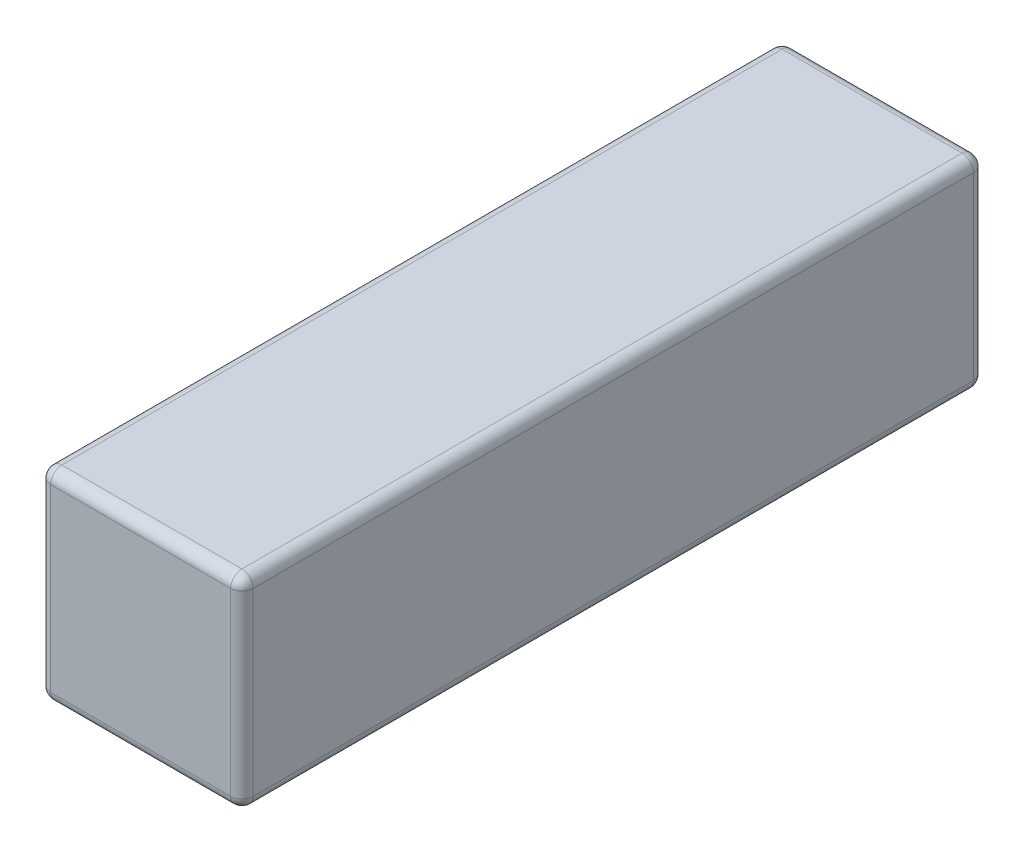
ISO-10303-21;
HEADER;
FILE_DESCRIPTION(('STEP AP214'),'2;1');
FILE_NAME('part.step','',(''),(''),'','','');
FILE_SCHEMA(('AUTOMOTIVE_DESIGN { 1 0 10303 214 1 1 1 1 }'));
ENDSEC;
DATA;
#1=APPLICATION_CONTEXT('core data for automotive mechanical design processes');
#2=APPLICATION_PROTOCOL_DEFINITION('international standard','automotive_design',2000,#1);
#3=PRODUCT_CONTEXT('',#1,'mechanical');
#4=PRODUCT('Part','Part','',(#3));
#5=PRODUCT_RELATED_PRODUCT_CATEGORY('part','',(#4));
#6=PRODUCT_DEFINITION_FORMATION('','',#4);
#7=PRODUCT_DEFINITION_CONTEXT('part definition',#1,'design');
#8=PRODUCT_DEFINITION('design','',#6,#7);
#9=PRODUCT_DEFINITION_SHAPE('','',#8);
#10=(LENGTH_UNIT() NAMED_UNIT(*) SI_UNIT(.MILLI.,.METRE.));
#11=(NAMED_UNIT(*) PLANE_ANGLE_UNIT() SI_UNIT($,.RADIAN.));
#12=(NAMED_UNIT(*) SI_UNIT($,.STERADIAN.) SOLID_ANGLE_UNIT());
#13=UNCERTAINTY_MEASURE_WITH_UNIT(LENGTH_MEASURE(1.E-05),#10,'distance_accuracy_value','');
#14=(GEOMETRIC_REPRESENTATION_CONTEXT(3) GLOBAL_UNCERTAINTY_ASSIGNED_CONTEXT((#13)) GLOBAL_UNIT_ASSIGNED_CONTEXT((#10,
#11,#12)) REPRESENTATION_CONTEXT('',''));
#15=CARTESIAN_POINT('',(0.,0.,0.));
#16=DIRECTION('',(0.,0.,1.));
#17=DIRECTION('',(1.,0.,0.));
#18=AXIS2_PLACEMENT_3D('',#15,#16,#17);
#19=CARTESIAN_POINT('',(-4.5,4.5,33.));
#20=DIRECTION('',(1.,0.,0.));
#21=DIRECTION('',(0.,1.,0.));
#22=AXIS2_PLACEMENT_3D('',#19,#20,#21);
#23=PLANE('',#22);
#24=DIRECTION('',(0.,-1.,0.));
#25=VECTOR('',#24,1.);
#26=CARTESIAN_POINT('',(-4.5,4.5,32.5));
#27=LINE('',#26,#25);
#28=CARTESIAN_POINT('',(-4.5,-4.,32.5));
#29=VERTEX_POINT('',#28);
#30=CARTESIAN_POINT('',(-4.5,4.,32.5));
#31=VERTEX_POINT('',#30);
#32=EDGE_CURVE('E196',#29,#31,#27,.F.);
#33=ORIENTED_EDGE('',*,*,#32,.T.);
#34=DIRECTION('',(0.,0.,-1.));
#35=VECTOR('',#34,1.);
#36=CARTESIAN_POINT('',(-4.5,4.,33.));
#37=LINE('',#36,#35);
#38=CARTESIAN_POINT('',(-4.5,4.,0.5));
#39=VERTEX_POINT('',#38);
#40=EDGE_CURVE('E201',#31,#39,#37,.T.);
#41=ORIENTED_EDGE('',*,*,#40,.T.);
#42=DIRECTION('',(0.,-1.,0.));
#43=VECTOR('',#42,1.);
#44=CARTESIAN_POINT('',(-4.5,-4.5,0.5));
#45=LINE('',#44,#43);
#46=CARTESIAN_POINT('',(-4.5,-4.,0.5));
#47=VERTEX_POINT('',#46);
#48=EDGE_CURVE('E198',#39,#47,#45,.T.);
#49=ORIENTED_EDGE('',*,*,#48,.T.);
#50=DIRECTION('',(0.,0.,-1.));
#51=VECTOR('',#50,1.);
#52=CARTESIAN_POINT('',(-4.5,-4.,33.));
#53=LINE('',#52,#51);
#54=EDGE_CURVE('E194',#47,#29,#53,.F.);
#55=ORIENTED_EDGE('',*,*,#54,.T.);
#56=EDGE_LOOP('',(#33,#41,#49,#55));
#57=FACE_BOUND('',#56,.T.);
#58=ADVANCED_FACE('F33',(#57),#23,.F.);
#59=CARTESIAN_POINT('',(4.5,-4.5,33.));
#60=DIRECTION('',(0.,1.,0.));
#61=DIRECTION('',(-1.,0.,0.));
#62=AXIS2_PLACEMENT_3D('',#59,#60,#61);
#63=PLANE('',#62);
#64=DIRECTION('',(1.,0.,0.));
#65=VECTOR('',#64,1.);
#66=CARTESIAN_POINT('',(4.5,-4.5,32.5));
#67=LINE('',#66,#65);
#68=CARTESIAN_POINT('',(4.,-4.5,32.5));
#69=VERTEX_POINT('',#68);
#70=CARTESIAN_POINT('',(-4.,-4.5,32.5));
#71=VERTEX_POINT('',#70);
#72=EDGE_CURVE('E187',#69,#71,#67,.F.);
#73=ORIENTED_EDGE('',*,*,#72,.T.);
#74=DIRECTION('',(0.,0.,-1.));
#75=VECTOR('',#74,1.);
#76=CARTESIAN_POINT('',(-4.,-4.5,33.));
#77=LINE('',#76,#75);
#78=CARTESIAN_POINT('',(-4.,-4.5,0.5));
#79=VERTEX_POINT('',#78);
#80=EDGE_CURVE('E192',#71,#79,#77,.T.);
#81=ORIENTED_EDGE('',*,*,#80,.T.);
#82=DIRECTION('',(1.,0.,0.));
#83=VECTOR('',#82,1.);
#84=CARTESIAN_POINT('',(4.5,-4.5,0.5));
#85=LINE('',#84,#83);
#86=CARTESIAN_POINT('',(4.,-4.5,0.5));
#87=VERTEX_POINT('',#86);
#88=EDGE_CURVE('E189',#79,#87,#85,.T.);
#89=ORIENTED_EDGE('',*,*,#88,.T.);
#90=DIRECTION('',(0.,0.,-1.));
#91=VECTOR('',#90,1.);
#92=CARTESIAN_POINT('',(4.,-4.5,33.));
#93=LINE('',#92,#91);
#94=EDGE_CURVE('E185',#87,#69,#93,.F.);
#95=ORIENTED_EDGE('',*,*,#94,.T.);
#96=EDGE_LOOP('',(#73,#81,#89,#95));
#97=FACE_BOUND('',#96,.T.);
#98=ADVANCED_FACE('F287',(#97),#63,.F.);
#99=CARTESIAN_POINT('',(4.5,4.5,33.));
#100=DIRECTION('',(-1.,0.,0.));
#101=DIRECTION('',(0.,-1.,0.));
#102=AXIS2_PLACEMENT_3D('',#99,#100,#101);
#103=PLANE('',#102);
#104=DIRECTION('',(0.,1.,0.));
#105=VECTOR('',#104,1.);
#106=CARTESIAN_POINT('',(4.5,4.5,32.5));
#107=LINE('',#106,#105);
#108=CARTESIAN_POINT('',(4.5,4.,32.5));
#109=VERTEX_POINT('',#108);
#110=CARTESIAN_POINT('',(4.5,-4.,32.5));
#111=VERTEX_POINT('',#110);
#112=EDGE_CURVE('E178',#109,#111,#107,.F.);
#113=ORIENTED_EDGE('',*,*,#112,.T.);
#114=DIRECTION('',(0.,0.,-1.));
#115=VECTOR('',#114,1.);
#116=CARTESIAN_POINT('',(4.5,-4.,33.));
#117=LINE('',#116,#115);
#118=CARTESIAN_POINT('',(4.5,-4.,0.5));
#119=VERTEX_POINT('',#118);
#120=EDGE_CURVE('E183',#111,#119,#117,.T.);
#121=ORIENTED_EDGE('',*,*,#120,.T.);
#122=DIRECTION('',(0.,1.,0.));
#123=VECTOR('',#122,1.);
#124=CARTESIAN_POINT('',(4.5,4.5,0.5));
#125=LINE('',#124,#123);
#126=CARTESIAN_POINT('',(4.5,4.,0.5));
#127=VERTEX_POINT('',#126);
#128=EDGE_CURVE('E180',#119,#127,#125,.T.);
#129=ORIENTED_EDGE('',*,*,#128,.T.);
#130=DIRECTION('',(0.,0.,-1.));
#131=VECTOR('',#130,1.);
#132=CARTESIAN_POINT('',(4.5,4.,33.));
#133=LINE('',#132,#131);
#134=EDGE_CURVE('E176',#127,#109,#133,.F.);
#135=ORIENTED_EDGE('',*,*,#134,.T.);
#136=EDGE_LOOP('',(#113,#121,#129,#135));
#137=FACE_BOUND('',#136,.T.);
#138=ADVANCED_FACE('F307',(#137),#103,.F.);
#139=CARTESIAN_POINT('',(4.5,4.5,33.));
#140=DIRECTION('',(0.,-1.,0.));
#141=DIRECTION('',(1.,0.,0.));
#142=AXIS2_PLACEMENT_3D('',#139,#140,#141);
#143=PLANE('',#142);
#144=DIRECTION('',(-1.,0.,0.));
#145=VECTOR('',#144,1.);
#146=CARTESIAN_POINT('',(-4.5,4.5,0.5));
#147=LINE('',#146,#145);
#148=CARTESIAN_POINT('',(4.,4.5,0.5));
#149=VERTEX_POINT('',#148);
#150=CARTESIAN_POINT('',(-4.,4.5,0.5));
#151=VERTEX_POINT('',#150);
#152=EDGE_CURVE('E136',#149,#151,#147,.T.);
#153=ORIENTED_EDGE('',*,*,#152,.T.);
#154=DIRECTION('',(0.,0.,-1.));
#155=VECTOR('',#154,1.);
#156=CARTESIAN_POINT('',(-4.,4.5,33.));
#157=LINE('',#156,#155);
#158=CARTESIAN_POINT('',(-4.,4.5,32.5));
#159=VERTEX_POINT('',#158);
#160=EDGE_CURVE('E132',#151,#159,#157,.F.);
#161=ORIENTED_EDGE('',*,*,#160,.T.);
#162=DIRECTION('',(-1.,0.,0.));
#163=VECTOR('',#162,1.);
#164=CARTESIAN_POINT('',(4.5,4.5,32.5));
#165=LINE('',#164,#163);
#166=CARTESIAN_POINT('',(4.,4.5,32.5));
#167=VERTEX_POINT('',#166);
#168=EDGE_CURVE('E124',#159,#167,#165,.F.);
#169=ORIENTED_EDGE('',*,*,#168,.T.);
#170=DIRECTION('',(0.,0.,-1.));
#171=VECTOR('',#170,1.);
#172=CARTESIAN_POINT('',(4.,4.5,33.));
#173=LINE('',#172,#171);
#174=EDGE_CURVE('E129',#167,#149,#173,.T.);
#175=ORIENTED_EDGE('',*,*,#174,.T.);
#176=EDGE_LOOP('',(#153,#161,#169,#175));
#177=FACE_BOUND('',#176,.T.);
#178=ADVANCED_FACE('F127',(#177),#143,.F.);
#179=CARTESIAN_POINT('',(0.,0.,33.));
#180=DIRECTION('',(0.,0.,-1.));
#181=DIRECTION('',(-1.,0.,0.));
#182=AXIS2_PLACEMENT_3D('',#179,#180,#181);
#183=PLANE('',#182);
#184=DIRECTION('',(-1.,0.,0.));
#185=VECTOR('',#184,1.);
#186=CARTESIAN_POINT('',(0.,4.,33.));
#187=LINE('',#186,#185);
#188=CARTESIAN_POINT('',(4.,4.,33.));
#189=VERTEX_POINT('',#188);
#190=CARTESIAN_POINT('',(-4.,4.,33.));
#191=VERTEX_POINT('',#190);
#192=EDGE_CURVE('E143',#189,#191,#187,.T.);
#193=ORIENTED_EDGE('',*,*,#192,.T.);
#194=DIRECTION('',(0.,-1.,0.));
#195=VECTOR('',#194,1.);
#196=CARTESIAN_POINT('',(-4.,0.,33.));
#197=LINE('',#196,#195);
#198=CARTESIAN_POINT('',(-4.,-4.,33.));
#199=VERTEX_POINT('',#198);
#200=EDGE_CURVE('E11',#191,#199,#197,.T.);
#201=ORIENTED_EDGE('',*,*,#200,.T.);
#202=DIRECTION('',(1.,0.,0.));
#203=VECTOR('',#202,1.);
#204=CARTESIAN_POINT('',(0.,-4.,33.));
#205=LINE('',#204,#203);
#206=CARTESIAN_POINT('',(4.,-4.,33.));
#207=VERTEX_POINT('',#206);
#208=EDGE_CURVE('E42',#199,#207,#205,.T.);
#209=ORIENTED_EDGE('',*,*,#208,.T.);
#210=DIRECTION('',(0.,1.,0.));
#211=VECTOR('',#210,1.);
#212=CARTESIAN_POINT('',(4.,0.,33.));
#213=LINE('',#212,#211);
#214=EDGE_CURVE('E204',#207,#189,#213,.T.);
#215=ORIENTED_EDGE('',*,*,#214,.T.);
#216=EDGE_LOOP('',(#193,#201,#209,#215));
#217=FACE_BOUND('',#216,.T.);
#218=ADVANCED_FACE('F260',(#217),#183,.F.);
#219=CARTESIAN_POINT('',(0.,0.,0.));
#220=DIRECTION('',(0.,0.,-1.));
#221=DIRECTION('',(-1.,0.,0.));
#222=AXIS2_PLACEMENT_3D('',#219,#220,#221);
#223=PLANE('',#222);
#224=DIRECTION('',(0.,-1.,0.));
#225=VECTOR('',#224,1.);
#226=CARTESIAN_POINT('',(-4.,4.5,0.));
#227=LINE('',#226,#225);
#228=CARTESIAN_POINT('',(-4.,-4.,0.));
#229=VERTEX_POINT('',#228);
#230=CARTESIAN_POINT('',(-4.,4.,0.));
#231=VERTEX_POINT('',#230);
#232=EDGE_CURVE('E167',#229,#231,#227,.F.);
#233=ORIENTED_EDGE('',*,*,#232,.T.);
#234=DIRECTION('',(-1.,0.,0.));
#235=VECTOR('',#234,1.);
#236=CARTESIAN_POINT('',(4.5,4.,0.));
#237=LINE('',#236,#235);
#238=CARTESIAN_POINT('',(4.,4.,0.));
#239=VERTEX_POINT('',#238);
#240=EDGE_CURVE('E173',#231,#239,#237,.F.);
#241=ORIENTED_EDGE('',*,*,#240,.T.);
#242=DIRECTION('',(0.,1.,0.));
#243=VECTOR('',#242,1.);
#244=CARTESIAN_POINT('',(4.,-4.5,0.));
#245=LINE('',#244,#243);
#246=CARTESIAN_POINT('',(4.,-4.,0.));
#247=VERTEX_POINT('',#246);
#248=EDGE_CURVE('E171',#239,#247,#245,.F.);
#249=ORIENTED_EDGE('',*,*,#248,.T.);
#250=DIRECTION('',(1.,0.,0.));
#251=VECTOR('',#250,1.);
#252=CARTESIAN_POINT('',(-4.5,-4.,0.));
#253=LINE('',#252,#251);
#254=EDGE_CURVE('E169',#247,#229,#253,.F.);
#255=ORIENTED_EDGE('',*,*,#254,.T.);
#256=EDGE_LOOP('',(#233,#241,#249,#255));
#257=FACE_BOUND('',#256,.T.);
#258=ADVANCED_FACE('F340',(#257),#223,.T.);
#259=CARTESIAN_POINT('',(0.,-4.,32.5));
#260=DIRECTION('',(1.,0.,0.));
#261=DIRECTION('',(0.,1.,0.));
#262=AXIS2_PLACEMENT_3D('',#259,#260,#261);
#263=CYLINDRICAL_SURFACE('',#262,0.5);
#264=CARTESIAN_POINT('',(4.,-4.,32.5));
#265=DIRECTION('',(1.,0.,0.));
#266=DIRECTION('',(0.,0.,-1.));
#267=AXIS2_PLACEMENT_3D('',#264,#265,#266);
#268=CIRCLE('',#267,0.5);
#269=EDGE_CURVE('E37',#207,#69,#268,.T.);
#270=ORIENTED_EDGE('',*,*,#269,.F.);
#271=ORIENTED_EDGE('',*,*,#208,.F.);
#272=CARTESIAN_POINT('',(-4.,-4.,32.5));
#273=DIRECTION('',(-1.,0.,0.));
#274=DIRECTION('',(0.,0.,1.));
#275=AXIS2_PLACEMENT_3D('',#272,#273,#274);
#276=CIRCLE('',#275,0.5);
#277=EDGE_CURVE('E163',#71,#199,#276,.T.);
#278=ORIENTED_EDGE('',*,*,#277,.F.);
#279=ORIENTED_EDGE('',*,*,#72,.F.);
#280=EDGE_LOOP('',(#270,#271,#278,#279));
#281=FACE_BOUND('',#280,.T.);
#282=ADVANCED_FACE('F35',(#281),#263,.T.);
#283=CARTESIAN_POINT('',(4.,-4.,32.5));
#284=DIRECTION('',(0.,0.,1.));
#285=DIRECTION('',(1.,0.,0.));
#286=AXIS2_PLACEMENT_3D('',#283,#284,#285);
#287=SPHERICAL_SURFACE('',#286,0.5);
#288=CARTESIAN_POINT('',(4.,-4.,32.5));
#289=DIRECTION('',(0.,-1.,0.));
#290=DIRECTION('',(0.,0.,-1.));
#291=AXIS2_PLACEMENT_3D('',#288,#289,#290);
#292=CIRCLE('',#291,0.5);
#293=EDGE_CURVE('E247',#207,#111,#292,.F.);
#294=ORIENTED_EDGE('',*,*,#293,.F.);
#295=ORIENTED_EDGE('',*,*,#269,.T.);
#296=CARTESIAN_POINT('',(4.,-4.,32.5));
#297=DIRECTION('',(0.,0.,1.));
#298=DIRECTION('',(1.,0.,0.));
#299=AXIS2_PLACEMENT_3D('',#296,#297,#298);
#300=CIRCLE('',#299,0.5);
#301=EDGE_CURVE('E250',#111,#69,#300,.F.);
#302=ORIENTED_EDGE('',*,*,#301,.F.);
#303=EDGE_LOOP('',(#294,#295,#302));
#304=FACE_BOUND('',#303,.T.);
#305=ADVANCED_FACE('F301',(#304),#287,.T.);
#306=CARTESIAN_POINT('',(-4.,-4.,32.5));
#307=DIRECTION('',(0.,0.,1.));
#308=DIRECTION('',(1.,0.,0.));
#309=AXIS2_PLACEMENT_3D('',#306,#307,#308);
#310=SPHERICAL_SURFACE('',#309,0.5);
#311=CARTESIAN_POINT('',(-4.,-4.,32.5));
#312=DIRECTION('',(0.,0.,1.));
#313=DIRECTION('',(1.,0.,0.));
#314=AXIS2_PLACEMENT_3D('',#311,#312,#313);
#315=CIRCLE('',#314,0.5);
#316=EDGE_CURVE('E243',#71,#29,#315,.F.);
#317=ORIENTED_EDGE('',*,*,#316,.F.);
#318=ORIENTED_EDGE('',*,*,#277,.T.);
#319=CARTESIAN_POINT('',(-4.,-4.,32.5));
#320=DIRECTION('',(0.,-1.,0.));
#321=DIRECTION('',(0.,0.,-1.));
#322=AXIS2_PLACEMENT_3D('',#319,#320,#321);
#323=CIRCLE('',#322,0.5);
#324=EDGE_CURVE('E50',#29,#199,#323,.F.);
#325=ORIENTED_EDGE('',*,*,#324,.F.);
#326=EDGE_LOOP('',(#317,#318,#325));
#327=FACE_BOUND('',#326,.T.);
#328=ADVANCED_FACE('F255',(#327),#310,.T.);
#329=CARTESIAN_POINT('',(4.,-4.,33.));
#330=DIRECTION('',(0.,0.,-1.));
#331=DIRECTION('',(-1.,0.,0.));
#332=AXIS2_PLACEMENT_3D('',#329,#330,#331);
#333=CYLINDRICAL_SURFACE('',#332,0.5);
#334=ORIENTED_EDGE('',*,*,#301,.T.);
#335=ORIENTED_EDGE('',*,*,#94,.F.);
#336=CARTESIAN_POINT('',(4.,-4.,0.5));
#337=DIRECTION('',(0.,0.,-1.));
#338=DIRECTION('',(-1.,0.,0.));
#339=AXIS2_PLACEMENT_3D('',#336,#337,#338);
#340=CIRCLE('',#339,0.5);
#341=EDGE_CURVE('E238',#119,#87,#340,.T.);
#342=ORIENTED_EDGE('',*,*,#341,.F.);
#343=ORIENTED_EDGE('',*,*,#120,.F.);
#344=EDGE_LOOP('',(#334,#335,#342,#343));
#345=FACE_BOUND('',#344,.T.);
#346=ADVANCED_FACE('F297',(#345),#333,.T.);
#347=CARTESIAN_POINT('',(4.,0.,32.5));
#348=DIRECTION('',(0.,1.,0.));
#349=DIRECTION('',(-1.,0.,0.));
#350=AXIS2_PLACEMENT_3D('',#347,#348,#349);
#351=CYLINDRICAL_SURFACE('',#350,0.5);
#352=ORIENTED_EDGE('',*,*,#293,.T.);
#353=ORIENTED_EDGE('',*,*,#112,.F.);
#354=CARTESIAN_POINT('',(4.,4.,32.5));
#355=DIRECTION('',(0.,1.,0.));
#356=DIRECTION('',(0.,0.,1.));
#357=AXIS2_PLACEMENT_3D('',#354,#355,#356);
#358=CIRCLE('',#357,0.5);
#359=EDGE_CURVE('E147',#189,#109,#358,.T.);
#360=ORIENTED_EDGE('',*,*,#359,.F.);
#361=ORIENTED_EDGE('',*,*,#214,.F.);
#362=EDGE_LOOP('',(#352,#353,#360,#361));
#363=FACE_BOUND('',#362,.T.);
#364=ADVANCED_FACE('F305',(#363),#351,.T.);
#365=CARTESIAN_POINT('',(0.,4.,32.5));
#366=DIRECTION('',(-1.,0.,0.));
#367=DIRECTION('',(0.,-1.,0.));
#368=AXIS2_PLACEMENT_3D('',#365,#366,#367);
#369=CYLINDRICAL_SURFACE('',#368,0.5);
#370=CARTESIAN_POINT('',(-4.,4.,32.5));
#371=DIRECTION('',(-1.,0.,0.));
#372=DIRECTION('',(0.,-1.,0.));
#373=AXIS2_PLACEMENT_3D('',#370,#371,#372);
#374=CIRCLE('',#373,0.5);
#375=EDGE_CURVE('E148',#191,#159,#374,.T.);
#376=ORIENTED_EDGE('',*,*,#375,.F.);
#377=ORIENTED_EDGE('',*,*,#192,.F.);
#378=CARTESIAN_POINT('',(4.,4.,32.5));
#379=DIRECTION('',(1.,0.,0.));
#380=DIRECTION('',(0.,0.,-1.));
#381=AXIS2_PLACEMENT_3D('',#378,#379,#380);
#382=CIRCLE('',#381,0.5);
#383=EDGE_CURVE('E140',#167,#189,#382,.T.);
#384=ORIENTED_EDGE('',*,*,#383,.F.);
#385=ORIENTED_EDGE('',*,*,#168,.F.);
#386=EDGE_LOOP('',(#376,#377,#384,#385));
#387=FACE_BOUND('',#386,.T.);
#388=ADVANCED_FACE('F142',(#387),#369,.T.);
#389=CARTESIAN_POINT('',(-4.,0.,32.5));
#390=DIRECTION('',(0.,-1.,0.));
#391=DIRECTION('',(1.,0.,0.));
#392=AXIS2_PLACEMENT_3D('',#389,#390,#391);
#393=CYLINDRICAL_SURFACE('',#392,0.5);
#394=ORIENTED_EDGE('',*,*,#324,.T.);
#395=ORIENTED_EDGE('',*,*,#200,.F.);
#396=CARTESIAN_POINT('',(-4.,4.,32.5));
#397=DIRECTION('',(0.,1.,0.));
#398=DIRECTION('',(0.,0.,1.));
#399=AXIS2_PLACEMENT_3D('',#396,#397,#398);
#400=CIRCLE('',#399,0.5);
#401=EDGE_CURVE('E233',#31,#191,#400,.T.);
#402=ORIENTED_EDGE('',*,*,#401,.F.);
#403=ORIENTED_EDGE('',*,*,#32,.F.);
#404=EDGE_LOOP('',(#394,#395,#402,#403));
#405=FACE_BOUND('',#404,.T.);
#406=ADVANCED_FACE('F262',(#405),#393,.T.);
#407=CARTESIAN_POINT('',(-4.,-4.,33.));
#408=DIRECTION('',(0.,0.,-1.));
#409=DIRECTION('',(-1.,0.,0.));
#410=AXIS2_PLACEMENT_3D('',#407,#408,#409);
#411=CYLINDRICAL_SURFACE('',#410,0.5);
#412=ORIENTED_EDGE('',*,*,#316,.T.);
#413=ORIENTED_EDGE('',*,*,#54,.F.);
#414=CARTESIAN_POINT('',(-4.,-4.,0.5));
#415=DIRECTION('',(0.,0.,-1.));
#416=DIRECTION('',(-1.,0.,0.));
#417=AXIS2_PLACEMENT_3D('',#414,#415,#416);
#418=CIRCLE('',#417,0.5);
#419=EDGE_CURVE('E230',#79,#47,#418,.T.);
#420=ORIENTED_EDGE('',*,*,#419,.F.);
#421=ORIENTED_EDGE('',*,*,#80,.F.);
#422=EDGE_LOOP('',(#412,#413,#420,#421));
#423=FACE_BOUND('',#422,.T.);
#424=ADVANCED_FACE('F284',(#423),#411,.T.);
#425=CARTESIAN_POINT('',(4.5,-4.,0.5));
#426=DIRECTION('',(-1.,0.,0.));
#427=DIRECTION('',(0.,-1.,0.));
#428=AXIS2_PLACEMENT_3D('',#425,#426,#427);
#429=CYLINDRICAL_SURFACE('',#428,0.5);
#430=CARTESIAN_POINT('',(4.,-4.,0.5));
#431=DIRECTION('',(1.,0.,0.));
#432=DIRECTION('',(0.,0.,-1.));
#433=AXIS2_PLACEMENT_3D('',#430,#431,#432);
#434=CIRCLE('',#433,0.5);
#435=EDGE_CURVE('E240',#87,#247,#434,.T.);
#436=ORIENTED_EDGE('',*,*,#435,.F.);
#437=ORIENTED_EDGE('',*,*,#88,.F.);
#438=CARTESIAN_POINT('',(-4.,-4.,0.5));
#439=DIRECTION('',(-1.,0.,0.));
#440=DIRECTION('',(0.,0.,1.));
#441=AXIS2_PLACEMENT_3D('',#438,#439,#440);
#442=CIRCLE('',#441,0.5);
#443=EDGE_CURVE('E227',#229,#79,#442,.T.);
#444=ORIENTED_EDGE('',*,*,#443,.F.);
#445=ORIENTED_EDGE('',*,*,#254,.F.);
#446=EDGE_LOOP('',(#436,#437,#444,#445));
#447=FACE_BOUND('',#446,.T.);
#448=ADVANCED_FACE('F290',(#447),#429,.T.);
#449=CARTESIAN_POINT('',(4.,-4.,0.5));
#450=DIRECTION('',(0.,0.,1.));
#451=DIRECTION('',(1.,0.,0.));
#452=AXIS2_PLACEMENT_3D('',#449,#450,#451);
#453=SPHERICAL_SURFACE('',#452,0.5);
#454=ORIENTED_EDGE('',*,*,#341,.T.);
#455=ORIENTED_EDGE('',*,*,#435,.T.);
#456=CARTESIAN_POINT('',(4.,-4.,0.5));
#457=DIRECTION('',(0.,-1.,0.));
#458=DIRECTION('',(1.,0.,0.));
#459=AXIS2_PLACEMENT_3D('',#456,#457,#458);
#460=CIRCLE('',#459,0.5);
#461=EDGE_CURVE('E155',#119,#247,#460,.F.);
#462=ORIENTED_EDGE('',*,*,#461,.F.);
#463=EDGE_LOOP('',(#454,#455,#462));
#464=FACE_BOUND('',#463,.T.);
#465=ADVANCED_FACE('F405',(#464),#453,.T.);
#466=CARTESIAN_POINT('',(4.,4.,32.5));
#467=DIRECTION('',(0.,0.,1.));
#468=DIRECTION('',(1.,0.,0.));
#469=AXIS2_PLACEMENT_3D('',#466,#467,#468);
#470=SPHERICAL_SURFACE('',#469,0.5);
#471=ORIENTED_EDGE('',*,*,#383,.T.);
#472=ORIENTED_EDGE('',*,*,#359,.T.);
#473=CARTESIAN_POINT('',(4.,4.,32.5));
#474=DIRECTION('',(0.,0.,1.));
#475=DIRECTION('',(1.,0.,0.));
#476=AXIS2_PLACEMENT_3D('',#473,#474,#475);
#477=CIRCLE('',#476,0.5);
#478=EDGE_CURVE('E151',#167,#109,#477,.F.);
#479=ORIENTED_EDGE('',*,*,#478,.F.);
#480=EDGE_LOOP('',(#471,#472,#479));
#481=FACE_BOUND('',#480,.T.);
#482=ADVANCED_FACE('F152',(#481),#470,.T.);
#483=CARTESIAN_POINT('',(-4.,4.,32.5));
#484=DIRECTION('',(0.,0.,1.));
#485=DIRECTION('',(1.,0.,0.));
#486=AXIS2_PLACEMENT_3D('',#483,#484,#485);
#487=SPHERICAL_SURFACE('',#486,0.5);
#488=ORIENTED_EDGE('',*,*,#401,.T.);
#489=ORIENTED_EDGE('',*,*,#375,.T.);
#490=CARTESIAN_POINT('',(-4.,4.,32.5));
#491=DIRECTION('',(0.,0.,1.));
#492=DIRECTION('',(1.,0.,0.));
#493=AXIS2_PLACEMENT_3D('',#490,#491,#492);
#494=CIRCLE('',#493,0.5);
#495=EDGE_CURVE('E156',#31,#159,#494,.F.);
#496=ORIENTED_EDGE('',*,*,#495,.F.);
#497=EDGE_LOOP('',(#488,#489,#496));
#498=FACE_BOUND('',#497,.T.);
#499=ADVANCED_FACE('F265',(#498),#487,.T.);
#500=CARTESIAN_POINT('',(-4.,-4.,0.5));
#501=DIRECTION('',(0.,0.,1.));
#502=DIRECTION('',(1.,0.,0.));
#503=AXIS2_PLACEMENT_3D('',#500,#501,#502);
#504=SPHERICAL_SURFACE('',#503,0.5);
#505=ORIENTED_EDGE('',*,*,#443,.T.);
#506=ORIENTED_EDGE('',*,*,#419,.T.);
#507=CARTESIAN_POINT('',(-4.,-4.,0.5));
#508=DIRECTION('',(0.,-1.,0.));
#509=DIRECTION('',(0.,0.,-1.));
#510=AXIS2_PLACEMENT_3D('',#507,#508,#509);
#511=CIRCLE('',#510,0.5);
#512=EDGE_CURVE('E221',#229,#47,#511,.F.);
#513=ORIENTED_EDGE('',*,*,#512,.F.);
#514=EDGE_LOOP('',(#505,#506,#513));
#515=FACE_BOUND('',#514,.T.);
#516=ADVANCED_FACE('F281',(#515),#504,.T.);
#517=CARTESIAN_POINT('',(4.,4.5,0.5));
#518=DIRECTION('',(0.,-1.,0.));
#519=DIRECTION('',(1.,0.,0.));
#520=AXIS2_PLACEMENT_3D('',#517,#518,#519);
#521=CYLINDRICAL_SURFACE('',#520,0.5);
#522=ORIENTED_EDGE('',*,*,#461,.T.);
#523=ORIENTED_EDGE('',*,*,#248,.F.);
#524=CARTESIAN_POINT('',(4.,4.,0.5));
#525=DIRECTION('',(0.,1.,0.));
#526=DIRECTION('',(0.,0.,1.));
#527=AXIS2_PLACEMENT_3D('',#524,#525,#526);
#528=CIRCLE('',#527,0.5);
#529=EDGE_CURVE('E218',#127,#239,#528,.T.);
#530=ORIENTED_EDGE('',*,*,#529,.F.);
#531=ORIENTED_EDGE('',*,*,#128,.F.);
#532=EDGE_LOOP('',(#522,#523,#530,#531));
#533=FACE_BOUND('',#532,.T.);
#534=ADVANCED_FACE('F311',(#533),#521,.T.);
#535=CARTESIAN_POINT('',(4.,4.,33.));
#536=DIRECTION('',(0.,0.,-1.));
#537=DIRECTION('',(-1.,0.,0.));
#538=AXIS2_PLACEMENT_3D('',#535,#536,#537);
#539=CYLINDRICAL_SURFACE('',#538,0.5);
#540=ORIENTED_EDGE('',*,*,#478,.T.);
#541=ORIENTED_EDGE('',*,*,#134,.F.);
#542=CARTESIAN_POINT('',(4.,4.,0.5));
#543=DIRECTION('',(0.,0.,-1.));
#544=DIRECTION('',(-1.,0.,0.));
#545=AXIS2_PLACEMENT_3D('',#542,#543,#544);
#546=CIRCLE('',#545,0.5);
#547=EDGE_CURVE('E159',#149,#127,#546,.T.);
#548=ORIENTED_EDGE('',*,*,#547,.F.);
#549=ORIENTED_EDGE('',*,*,#174,.F.);
#550=EDGE_LOOP('',(#540,#541,#548,#549));
#551=FACE_BOUND('',#550,.T.);
#552=ADVANCED_FACE('F158',(#551),#539,.T.);
#553=CARTESIAN_POINT('',(-4.,4.,33.));
#554=DIRECTION('',(0.,0.,-1.));
#555=DIRECTION('',(-1.,0.,0.));
#556=AXIS2_PLACEMENT_3D('',#553,#554,#555);
#557=CYLINDRICAL_SURFACE('',#556,0.5);
#558=ORIENTED_EDGE('',*,*,#495,.T.);
#559=ORIENTED_EDGE('',*,*,#160,.F.);
#560=CARTESIAN_POINT('',(-4.,4.,0.5));
#561=DIRECTION('',(0.,0.,-1.));
#562=DIRECTION('',(-1.,0.,0.));
#563=AXIS2_PLACEMENT_3D('',#560,#561,#562);
#564=CIRCLE('',#563,0.5);
#565=EDGE_CURVE('E214',#39,#151,#564,.T.);
#566=ORIENTED_EDGE('',*,*,#565,.F.);
#567=ORIENTED_EDGE('',*,*,#40,.F.);
#568=EDGE_LOOP('',(#558,#559,#566,#567));
#569=FACE_BOUND('',#568,.T.);
#570=ADVANCED_FACE('F269',(#569),#557,.T.);
#571=CARTESIAN_POINT('',(-4.,4.5,0.5));
#572=DIRECTION('',(0.,1.,0.));
#573=DIRECTION('',(-1.,0.,0.));
#574=AXIS2_PLACEMENT_3D('',#571,#572,#573);
#575=CYLINDRICAL_SURFACE('',#574,0.5);
#576=ORIENTED_EDGE('',*,*,#512,.T.);
#577=ORIENTED_EDGE('',*,*,#48,.F.);
#578=CARTESIAN_POINT('',(-4.,4.,0.5));
#579=DIRECTION('',(0.,1.,0.));
#580=DIRECTION('',(0.,0.,1.));
#581=AXIS2_PLACEMENT_3D('',#578,#579,#580);
#582=CIRCLE('',#581,0.5);
#583=EDGE_CURVE('E211',#231,#39,#582,.T.);
#584=ORIENTED_EDGE('',*,*,#583,.F.);
#585=ORIENTED_EDGE('',*,*,#232,.F.);
#586=EDGE_LOOP('',(#576,#577,#584,#585));
#587=FACE_BOUND('',#586,.T.);
#588=ADVANCED_FACE('F274',(#587),#575,.T.);
#589=CARTESIAN_POINT('',(4.,4.,0.5));
#590=DIRECTION('',(0.,0.,1.));
#591=DIRECTION('',(1.,0.,0.));
#592=AXIS2_PLACEMENT_3D('',#589,#590,#591);
#593=SPHERICAL_SURFACE('',#592,0.5);
#594=ORIENTED_EDGE('',*,*,#547,.T.);
#595=ORIENTED_EDGE('',*,*,#529,.T.);
#596=CARTESIAN_POINT('',(4.,4.,0.5));
#597=DIRECTION('',(1.,0.,0.));
#598=DIRECTION('',(0.,0.,-1.));
#599=AXIS2_PLACEMENT_3D('',#596,#597,#598);
#600=CIRCLE('',#599,0.5);
#601=EDGE_CURVE('E209',#149,#239,#600,.F.);
#602=ORIENTED_EDGE('',*,*,#601,.F.);
#603=EDGE_LOOP('',(#594,#595,#602));
#604=FACE_BOUND('',#603,.T.);
#605=ADVANCED_FACE('F314',(#604),#593,.T.);
#606=CARTESIAN_POINT('',(-4.,4.,0.5));
#607=DIRECTION('',(0.,0.,1.));
#608=DIRECTION('',(1.,0.,0.));
#609=AXIS2_PLACEMENT_3D('',#606,#607,#608);
#610=SPHERICAL_SURFACE('',#609,0.5);
#611=ORIENTED_EDGE('',*,*,#583,.T.);
#612=ORIENTED_EDGE('',*,*,#565,.T.);
#613=CARTESIAN_POINT('',(-4.,4.,0.5));
#614=DIRECTION('',(-1.,0.,0.));
#615=DIRECTION('',(0.,0.,1.));
#616=AXIS2_PLACEMENT_3D('',#613,#614,#615);
#617=CIRCLE('',#616,0.5);
#618=EDGE_CURVE('E207',#231,#151,#617,.F.);
#619=ORIENTED_EDGE('',*,*,#618,.F.);
#620=EDGE_LOOP('',(#611,#612,#619));
#621=FACE_BOUND('',#620,.T.);
#622=ADVANCED_FACE('F320',(#621),#610,.T.);
#623=CARTESIAN_POINT('',(4.5,4.,0.5));
#624=DIRECTION('',(1.,0.,0.));
#625=DIRECTION('',(0.,1.,0.));
#626=AXIS2_PLACEMENT_3D('',#623,#624,#625);
#627=CYLINDRICAL_SURFACE('',#626,0.5);
#628=ORIENTED_EDGE('',*,*,#601,.T.);
#629=ORIENTED_EDGE('',*,*,#240,.F.);
#630=ORIENTED_EDGE('',*,*,#618,.T.);
#631=ORIENTED_EDGE('',*,*,#152,.F.);
#632=EDGE_LOOP('',(#628,#629,#630,#631));
#633=FACE_BOUND('',#632,.T.);
#634=ADVANCED_FACE('F317',(#633),#627,.T.);
#635=CLOSED_SHELL('',(#58,#98,#138,#178,#218,#258,#282,#305,#328,#346,#364,#388,#406,#424,#448,
#465,#482,#499,#516,#534,#552,#570,#588,#605,#622,#634));
#636=MANIFOLD_SOLID_BREP('B2',#635);
#637=ADVANCED_BREP_SHAPE_REPRESENTATION('',(#18,#636),#14);
#638=SHAPE_DEFINITION_REPRESENTATION(#9,#637);
ENDSEC;
END-ISO-10303-21;
